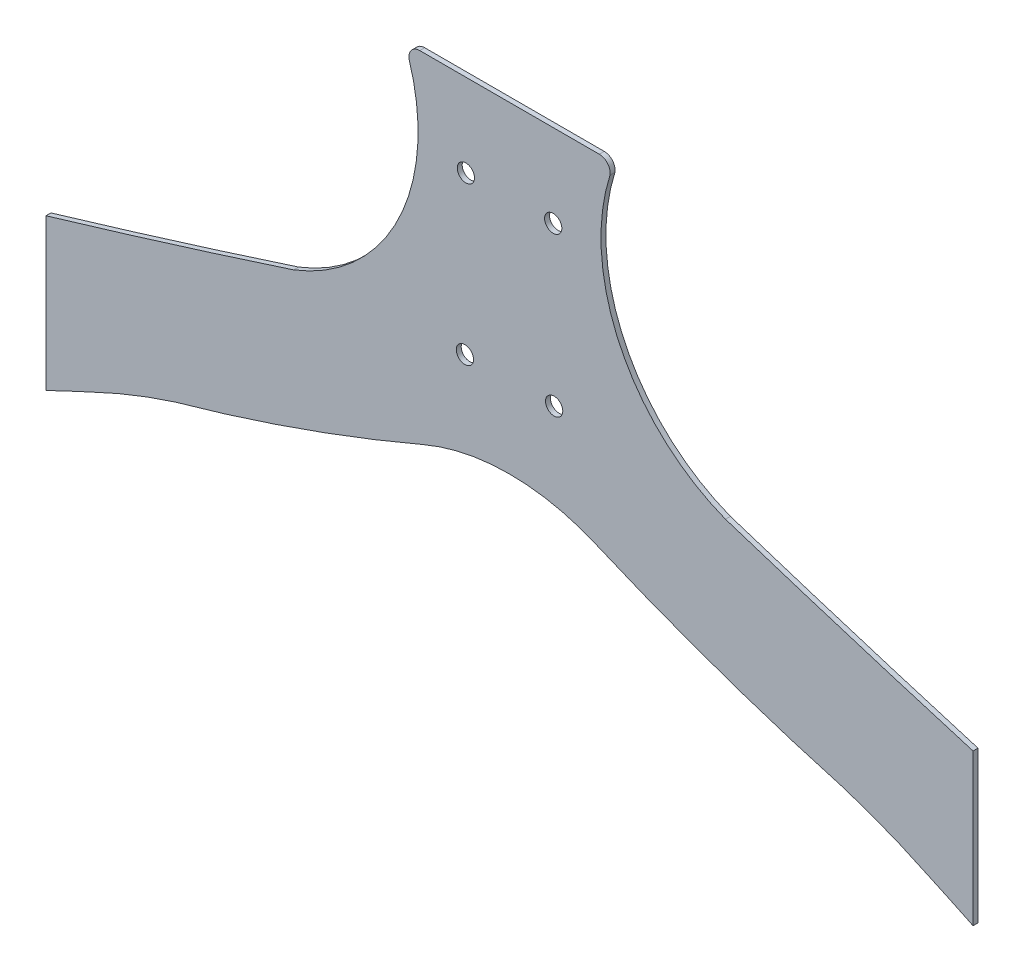
ISO-10303-21;
HEADER;
FILE_DESCRIPTION(('STEP AP214'),'2;1');
FILE_NAME('part.step','',(''),(''),'','','');
FILE_SCHEMA(('AUTOMOTIVE_DESIGN { 1 0 10303 214 1 1 1 1 }'));
ENDSEC;
DATA;
#1=APPLICATION_CONTEXT('core data for automotive mechanical design processes');
#2=APPLICATION_PROTOCOL_DEFINITION('international standard','automotive_design',2000,#1);
#3=PRODUCT_CONTEXT('',#1,'mechanical');
#4=PRODUCT('Part','Part','',(#3));
#5=PRODUCT_RELATED_PRODUCT_CATEGORY('part','',(#4));
#6=PRODUCT_DEFINITION_FORMATION('','',#4);
#7=PRODUCT_DEFINITION_CONTEXT('part definition',#1,'design');
#8=PRODUCT_DEFINITION('design','',#6,#7);
#9=PRODUCT_DEFINITION_SHAPE('','',#8);
#10=(LENGTH_UNIT() NAMED_UNIT(*) SI_UNIT(.MILLI.,.METRE.));
#11=(NAMED_UNIT(*) PLANE_ANGLE_UNIT() SI_UNIT($,.RADIAN.));
#12=(NAMED_UNIT(*) SI_UNIT($,.STERADIAN.) SOLID_ANGLE_UNIT());
#13=UNCERTAINTY_MEASURE_WITH_UNIT(LENGTH_MEASURE(1.E-05),#10,'distance_accuracy_value','');
#14=(GEOMETRIC_REPRESENTATION_CONTEXT(3) GLOBAL_UNCERTAINTY_ASSIGNED_CONTEXT((#13)) GLOBAL_UNIT_ASSIGNED_CONTEXT((#10,
#11,#12)) REPRESENTATION_CONTEXT('',''));
#15=CARTESIAN_POINT('',(0.,0.,0.));
#16=DIRECTION('',(0.,0.,1.));
#17=DIRECTION('',(1.,0.,0.));
#18=AXIS2_PLACEMENT_3D('',#15,#16,#17);
#19=CARTESIAN_POINT('',(-596.9,-624.582509856691,0.));
#20=DIRECTION('',(1.,0.,0.));
#21=DIRECTION('',(0.,0.,-1.));
#22=AXIS2_PLACEMENT_3D('',#19,#20,#21);
#23=PLANE('',#22);
#24=DIRECTION('',(0.,0.,-1.));
#25=VECTOR('',#24,1.);
#26=CARTESIAN_POINT('',(-596.9,-441.82233316805,6.35));
#27=LINE('',#26,#25);
#28=CARTESIAN_POINT('',(-596.9,-441.82233316805,0.));
#29=VERTEX_POINT('',#28);
#30=CARTESIAN_POINT('',(-596.9,-441.82233316805,6.35));
#31=VERTEX_POINT('',#30);
#32=EDGE_CURVE('E240',#29,#31,#27,.F.);
#33=ORIENTED_EDGE('',*,*,#32,.T.);
#34=DIRECTION('',(0.,1.,0.));
#35=VECTOR('',#34,1.);
#36=CARTESIAN_POINT('',(-596.9,-2169.24955294867,6.35));
#37=LINE('',#36,#35);
#38=CARTESIAN_POINT('',(-596.9,-246.912409222542,6.35));
#39=VERTEX_POINT('',#38);
#40=EDGE_CURVE('E45',#31,#39,#37,.T.);
#41=ORIENTED_EDGE('',*,*,#40,.T.);
#42=DIRECTION('',(0.,0.,-1.));
#43=VECTOR('',#42,1.);
#44=CARTESIAN_POINT('',(-596.9,-246.912409222542,6.35));
#45=LINE('',#44,#43);
#46=CARTESIAN_POINT('',(-596.9,-246.912409222542,0.));
#47=VERTEX_POINT('',#46);
#48=EDGE_CURVE('E244',#39,#47,#45,.T.);
#49=ORIENTED_EDGE('',*,*,#48,.T.);
#50=DIRECTION('',(0.,1.,0.));
#51=VECTOR('',#50,1.);
#52=CARTESIAN_POINT('',(-596.9,-2169.24955294867,0.));
#53=LINE('',#52,#51);
#54=EDGE_CURVE('E239',#29,#47,#53,.T.);
#55=ORIENTED_EDGE('',*,*,#54,.F.);
#56=EDGE_LOOP('',(#33,#41,#49,#55));
#57=FACE_BOUND('',#56,.T.);
#58=ADVANCED_FACE('F42',(#57),#23,.F.);
#59=CARTESIAN_POINT('',(596.9,-624.582509856691,0.));
#60=DIRECTION('',(-1.,0.,0.));
#61=DIRECTION('',(0.,0.,-1.));
#62=AXIS2_PLACEMENT_3D('',#59,#60,#61);
#63=PLANE('',#62);
#64=DIRECTION('',(0.,0.,-1.));
#65=VECTOR('',#64,1.);
#66=CARTESIAN_POINT('',(596.9,-441.822333168051,6.35));
#67=LINE('',#66,#65);
#68=CARTESIAN_POINT('',(596.9,-441.822333168051,6.35));
#69=VERTEX_POINT('',#68);
#70=CARTESIAN_POINT('',(596.9,-441.822333168051,0.));
#71=VERTEX_POINT('',#70);
#72=EDGE_CURVE('E236',#69,#71,#67,.T.);
#73=ORIENTED_EDGE('',*,*,#72,.T.);
#74=DIRECTION('',(0.,-1.,0.));
#75=VECTOR('',#74,1.);
#76=CARTESIAN_POINT('',(596.9,-2169.24955294867,0.));
#77=LINE('',#76,#75);
#78=CARTESIAN_POINT('',(596.9,-246.91240922256,0.));
#79=VERTEX_POINT('',#78);
#80=EDGE_CURVE('E251',#79,#71,#77,.T.);
#81=ORIENTED_EDGE('',*,*,#80,.F.);
#82=DIRECTION('',(0.,0.,-1.));
#83=VECTOR('',#82,1.);
#84=CARTESIAN_POINT('',(596.9,-246.91240922256,6.35));
#85=LINE('',#84,#83);
#86=CARTESIAN_POINT('',(596.9,-246.91240922256,6.35));
#87=VERTEX_POINT('',#86);
#88=EDGE_CURVE('E241',#79,#87,#85,.F.);
#89=ORIENTED_EDGE('',*,*,#88,.T.);
#90=DIRECTION('',(0.,-1.,0.));
#91=VECTOR('',#90,1.);
#92=CARTESIAN_POINT('',(596.9,-2169.24955294867,6.35));
#93=LINE('',#92,#91);
#94=EDGE_CURVE('E255',#87,#69,#93,.T.);
#95=ORIENTED_EDGE('',*,*,#94,.T.);
#96=EDGE_LOOP('',(#73,#81,#89,#95));
#97=FACE_BOUND('',#96,.T.);
#98=ADVANCED_FACE('F362',(#97),#63,.F.);
#99=CARTESIAN_POINT('',(-180.792418911107,-1158.29224131814,6.35));
#100=DIRECTION('',(0.,0.,-1.));
#101=DIRECTION('',(-1.,0.,0.));
#102=AXIS2_PLACEMENT_3D('',#99,#100,#101);
#103=CYLINDRICAL_SURFACE('',#102,825.460133846594);
#104=CARTESIAN_POINT('',(-180.792418911107,-1158.29224131814,0.));
#105=DIRECTION('',(0.,0.,1.));
#106=DIRECTION('',(1.,0.,0.));
#107=AXIS2_PLACEMENT_3D('',#104,#105,#106);
#108=CIRCLE('',#107,825.460133846594);
#109=CARTESIAN_POINT('',(-430.310537922391,-371.447186142019,0.));
#110=VERTEX_POINT('',#109);
#111=CARTESIAN_POINT('',(-538.684025261845,-414.452184132639,0.));
#112=VERTEX_POINT('',#111);
#113=EDGE_CURVE('E327',#110,#112,#108,.T.);
#114=ORIENTED_EDGE('',*,*,#113,.F.);
#115=DIRECTION('',(0.,0.,-1.));
#116=VECTOR('',#115,1.);
#117=CARTESIAN_POINT('',(-430.310537922391,-371.447186142019,6.35));
#118=LINE('',#117,#116);
#119=CARTESIAN_POINT('',(-430.310537922391,-371.447186142019,6.35));
#120=VERTEX_POINT('',#119);
#121=EDGE_CURVE('E302',#120,#110,#118,.T.);
#122=ORIENTED_EDGE('',*,*,#121,.F.);
#123=CARTESIAN_POINT('',(-180.792418911107,-1158.29224131814,6.35));
#124=DIRECTION('',(0.,0.,1.));
#125=DIRECTION('',(1.,0.,0.));
#126=AXIS2_PLACEMENT_3D('',#123,#124,#125);
#127=CIRCLE('',#126,825.460133846594);
#128=CARTESIAN_POINT('',(-538.684025261845,-414.452184132639,6.35));
#129=VERTEX_POINT('',#128);
#130=EDGE_CURVE('E201',#120,#129,#127,.T.);
#131=ORIENTED_EDGE('',*,*,#130,.T.);
#132=DIRECTION('',(0.,0.,-1.));
#133=VECTOR('',#132,1.);
#134=CARTESIAN_POINT('',(-538.684025261845,-414.452184132639,6.35));
#135=LINE('',#134,#133);
#136=EDGE_CURVE('E254',#129,#112,#135,.T.);
#137=ORIENTED_EDGE('',*,*,#136,.T.);
#138=EDGE_LOOP('',(#114,#122,#131,#137));
#139=FACE_BOUND('',#138,.T.);
#140=ADVANCED_FACE('F381',(#139),#103,.F.);
#141=CARTESIAN_POINT('',(-1123.56332868816,2110.77701358517,6.35));
#142=DIRECTION('',(0.,0.,-1.));
#143=DIRECTION('',(-1.,0.,0.));
#144=AXIS2_PLACEMENT_3D('',#141,#142,#143);
#145=CYLINDRICAL_SURFACE('',#144,2577.21485515194);
#146=CARTESIAN_POINT('',(-1123.56332868816,2110.77701358517,0.));
#147=DIRECTION('',(0.,0.,1.));
#148=DIRECTION('',(1.,0.,0.));
#149=AXIS2_PLACEMENT_3D('',#146,#147,#148);
#150=CIRCLE('',#149,2577.21485515194);
#151=CARTESIAN_POINT('',(-110.584086980493,-259.014003674616,0.));
#152=VERTEX_POINT('',#151);
#153=EDGE_CURVE('E324',#110,#152,#150,.T.);
#154=ORIENTED_EDGE('',*,*,#153,.T.);
#155=DIRECTION('',(0.,0.,-1.));
#156=VECTOR('',#155,1.);
#157=CARTESIAN_POINT('',(-110.584086980493,-259.014003674616,6.35));
#158=LINE('',#157,#156);
#159=CARTESIAN_POINT('',(-110.584086980493,-259.014003674616,6.35));
#160=VERTEX_POINT('',#159);
#161=EDGE_CURVE('E304',#160,#152,#158,.T.);
#162=ORIENTED_EDGE('',*,*,#161,.F.);
#163=CARTESIAN_POINT('',(-1123.56332868816,2110.77701358517,6.35));
#164=DIRECTION('',(0.,0.,1.));
#165=DIRECTION('',(1.,0.,0.));
#166=AXIS2_PLACEMENT_3D('',#163,#164,#165);
#167=CIRCLE('',#166,2577.21485515194);
#168=EDGE_CURVE('E199',#120,#160,#167,.T.);
#169=ORIENTED_EDGE('',*,*,#168,.F.);
#170=ORIENTED_EDGE('',*,*,#121,.T.);
#171=EDGE_LOOP('',(#154,#162,#169,#170));
#172=FACE_BOUND('',#171,.T.);
#173=ADVANCED_FACE('F386',(#172),#145,.T.);
#174=CARTESIAN_POINT('',(-0.50498949323341,-516.536019600514,6.35));
#175=DIRECTION('',(0.,0.,-1.));
#176=DIRECTION('',(-1.,0.,0.));
#177=AXIS2_PLACEMENT_3D('',#174,#175,#176);
#178=CYLINDRICAL_SURFACE('',#177,280.062486581386);
#179=CARTESIAN_POINT('',(-0.50498949323341,-516.536019600514,0.));
#180=DIRECTION('',(0.,0.,1.));
#181=DIRECTION('',(1.,0.,0.));
#182=AXIS2_PLACEMENT_3D('',#179,#180,#181);
#183=CIRCLE('',#182,280.062486581386);
#184=CARTESIAN_POINT('',(1.59837854757372E-10,-236.473988300731,0.));
#185=VERTEX_POINT('',#184);
#186=EDGE_CURVE('E321',#185,#152,#183,.T.);
#187=ORIENTED_EDGE('',*,*,#186,.F.);
#188=DIRECTION('',(0.,0.,-1.));
#189=VECTOR('',#188,1.);
#190=CARTESIAN_POINT('',(1.59837854757372E-10,-236.473988300731,6.35));
#191=LINE('',#190,#189);
#192=CARTESIAN_POINT('',(1.59837854757372E-10,-236.473988300731,6.35));
#193=VERTEX_POINT('',#192);
#194=EDGE_CURVE('E306',#193,#185,#191,.T.);
#195=ORIENTED_EDGE('',*,*,#194,.F.);
#196=CARTESIAN_POINT('',(-0.50498949323341,-516.536019600514,6.35));
#197=DIRECTION('',(0.,0.,1.));
#198=DIRECTION('',(1.,0.,0.));
#199=AXIS2_PLACEMENT_3D('',#196,#197,#198);
#200=CIRCLE('',#199,280.062486581386);
#201=EDGE_CURVE('E196',#193,#160,#200,.T.);
#202=ORIENTED_EDGE('',*,*,#201,.T.);
#203=ORIENTED_EDGE('',*,*,#161,.T.);
#204=EDGE_LOOP('',(#187,#195,#202,#203));
#205=FACE_BOUND('',#204,.T.);
#206=ADVANCED_FACE('F432',(#205),#178,.F.);
#207=CARTESIAN_POINT('',(0.50498949323341,-516.536019600514,6.35));
#208=DIRECTION('',(0.,0.,-1.));
#209=DIRECTION('',(-1.,0.,0.));
#210=AXIS2_PLACEMENT_3D('',#207,#208,#209);
#211=CYLINDRICAL_SURFACE('',#210,280.062486581385);
#212=CARTESIAN_POINT('',(0.50498949323341,-516.536019600514,0.));
#213=DIRECTION('',(0.,0.,1.));
#214=DIRECTION('',(1.,0.,0.));
#215=AXIS2_PLACEMENT_3D('',#212,#213,#214);
#216=CIRCLE('',#215,280.062486581385);
#217=CARTESIAN_POINT('',(110.584086980493,-259.014003674616,0.));
#218=VERTEX_POINT('',#217);
#219=EDGE_CURVE('E318',#218,#185,#216,.T.);
#220=ORIENTED_EDGE('',*,*,#219,.F.);
#221=DIRECTION('',(0.,0.,-1.));
#222=VECTOR('',#221,1.);
#223=CARTESIAN_POINT('',(110.584086980493,-259.014003674616,6.35));
#224=LINE('',#223,#222);
#225=CARTESIAN_POINT('',(110.584086980493,-259.014003674616,6.35));
#226=VERTEX_POINT('',#225);
#227=EDGE_CURVE('E308',#226,#218,#224,.T.);
#228=ORIENTED_EDGE('',*,*,#227,.F.);
#229=CARTESIAN_POINT('',(0.50498949323341,-516.536019600514,6.35));
#230=DIRECTION('',(0.,0.,1.));
#231=DIRECTION('',(1.,0.,0.));
#232=AXIS2_PLACEMENT_3D('',#229,#230,#231);
#233=CIRCLE('',#232,280.062486581385);
#234=EDGE_CURVE('E193',#226,#193,#233,.T.);
#235=ORIENTED_EDGE('',*,*,#234,.T.);
#236=ORIENTED_EDGE('',*,*,#194,.T.);
#237=EDGE_LOOP('',(#220,#228,#235,#236));
#238=FACE_BOUND('',#237,.T.);
#239=ADVANCED_FACE('F436',(#238),#211,.F.);
#240=CARTESIAN_POINT('',(1123.56332868816,2110.77701358517,6.35));
#241=DIRECTION('',(0.,0.,-1.));
#242=DIRECTION('',(-1.,0.,0.));
#243=AXIS2_PLACEMENT_3D('',#240,#241,#242);
#244=CYLINDRICAL_SURFACE('',#243,2577.21485515194);
#245=CARTESIAN_POINT('',(1123.56332868816,2110.77701358517,0.));
#246=DIRECTION('',(0.,0.,1.));
#247=DIRECTION('',(1.,0.,0.));
#248=AXIS2_PLACEMENT_3D('',#245,#246,#247);
#249=CIRCLE('',#248,2577.21485515194);
#250=CARTESIAN_POINT('',(430.310537918041,-371.447186140804,0.));
#251=VERTEX_POINT('',#250);
#252=EDGE_CURVE('E315',#218,#251,#249,.T.);
#253=ORIENTED_EDGE('',*,*,#252,.T.);
#254=DIRECTION('',(0.,0.,-1.));
#255=VECTOR('',#254,1.);
#256=CARTESIAN_POINT('',(430.310537918041,-371.447186140804,6.35));
#257=LINE('',#256,#255);
#258=CARTESIAN_POINT('',(430.310537918041,-371.447186140804,6.35));
#259=VERTEX_POINT('',#258);
#260=EDGE_CURVE('E310',#259,#251,#257,.T.);
#261=ORIENTED_EDGE('',*,*,#260,.F.);
#262=CARTESIAN_POINT('',(1123.56332868816,2110.77701358517,6.35));
#263=DIRECTION('',(0.,0.,1.));
#264=DIRECTION('',(1.,0.,0.));
#265=AXIS2_PLACEMENT_3D('',#262,#263,#264);
#266=CIRCLE('',#265,2577.21485515194);
#267=EDGE_CURVE('E190',#226,#259,#266,.T.);
#268=ORIENTED_EDGE('',*,*,#267,.F.);
#269=ORIENTED_EDGE('',*,*,#227,.T.);
#270=EDGE_LOOP('',(#253,#261,#268,#269));
#271=FACE_BOUND('',#270,.T.);
#272=ADVANCED_FACE('F440',(#271),#244,.T.);
#273=CARTESIAN_POINT('',(180.792418911064,-1158.29224131828,6.35));
#274=DIRECTION('',(0.,0.,-1.));
#275=DIRECTION('',(-1.,0.,0.));
#276=AXIS2_PLACEMENT_3D('',#273,#274,#275);
#277=CYLINDRICAL_SURFACE('',#276,825.460133846586);
#278=CARTESIAN_POINT('',(180.792418911064,-1158.29224131828,0.));
#279=DIRECTION('',(0.,0.,1.));
#280=DIRECTION('',(1.,0.,0.));
#281=AXIS2_PLACEMENT_3D('',#278,#279,#280);
#282=CIRCLE('',#281,825.460133846586);
#283=CARTESIAN_POINT('',(538.684025260286,-414.452184132056,0.));
#284=VERTEX_POINT('',#283);
#285=EDGE_CURVE('E247',#284,#251,#282,.T.);
#286=ORIENTED_EDGE('',*,*,#285,.F.);
#287=DIRECTION('',(0.,0.,-1.));
#288=VECTOR('',#287,1.);
#289=CARTESIAN_POINT('',(538.684025260286,-414.452184132056,6.35));
#290=LINE('',#289,#288);
#291=CARTESIAN_POINT('',(538.684025260286,-414.452184132056,6.35));
#292=VERTEX_POINT('',#291);
#293=EDGE_CURVE('E312',#292,#284,#290,.T.);
#294=ORIENTED_EDGE('',*,*,#293,.F.);
#295=CARTESIAN_POINT('',(180.792418911064,-1158.29224131828,6.35));
#296=DIRECTION('',(0.,0.,1.));
#297=DIRECTION('',(1.,0.,0.));
#298=AXIS2_PLACEMENT_3D('',#295,#296,#297);
#299=CIRCLE('',#298,825.460133846586);
#300=EDGE_CURVE('E187',#292,#259,#299,.T.);
#301=ORIENTED_EDGE('',*,*,#300,.T.);
#302=ORIENTED_EDGE('',*,*,#260,.T.);
#303=EDGE_LOOP('',(#286,#294,#301,#302));
#304=FACE_BOUND('',#303,.T.);
#305=ADVANCED_FACE('F373',(#304),#277,.F.);
#306=CARTESIAN_POINT('',(-577.914172720365,-2865.04040656693,6.35));
#307=DIRECTION('',(0.,0.,-1.));
#308=DIRECTION('',(-1.,0.,0.));
#309=AXIS2_PLACEMENT_3D('',#306,#307,#308);
#310=CYLINDRICAL_SURFACE('',#309,2692.98610684712);
#311=ORIENTED_EDGE('',*,*,#72,.F.);
#312=CARTESIAN_POINT('',(-577.914172720365,-2865.04040656693,6.35));
#313=DIRECTION('',(0.,0.,1.));
#314=DIRECTION('',(1.,0.,0.));
#315=AXIS2_PLACEMENT_3D('',#312,#313,#314);
#316=CIRCLE('',#315,2692.98610684712);
#317=EDGE_CURVE('E207',#69,#292,#316,.T.);
#318=ORIENTED_EDGE('',*,*,#317,.T.);
#319=ORIENTED_EDGE('',*,*,#293,.T.);
#320=CARTESIAN_POINT('',(-577.914172720365,-2865.04040656693,0.));
#321=DIRECTION('',(0.,0.,1.));
#322=DIRECTION('',(1.,0.,0.));
#323=AXIS2_PLACEMENT_3D('',#320,#321,#322);
#324=CIRCLE('',#323,2692.98610684712);
#325=EDGE_CURVE('E119',#71,#284,#324,.T.);
#326=ORIENTED_EDGE('',*,*,#325,.F.);
#327=EDGE_LOOP('',(#311,#318,#319,#326));
#328=FACE_BOUND('',#327,.T.);
#329=ADVANCED_FACE('F366',(#328),#310,.F.);
#330=CARTESIAN_POINT('',(4330.12511720554,12331.960297847,6.35));
#331=DIRECTION('',(0.,0.,-1.));
#332=DIRECTION('',(-1.,0.,0.));
#333=AXIS2_PLACEMENT_3D('',#330,#331,#332);
#334=CYLINDRICAL_SURFACE('',#333,13121.1664251466);
#335=ORIENTED_EDGE('',*,*,#88,.F.);
#336=CARTESIAN_POINT('',(4330.12511720554,12331.960297847,0.));
#337=DIRECTION('',(0.,0.,1.));
#338=DIRECTION('',(1.,0.,0.));
#339=AXIS2_PLACEMENT_3D('',#336,#337,#338);
#340=CIRCLE('',#339,13121.1664251466);
#341=CARTESIAN_POINT('',(278.076451396181,-147.85981168616,0.));
#342=VERTEX_POINT('',#341);
#343=EDGE_CURVE('E11',#342,#79,#340,.T.);
#344=ORIENTED_EDGE('',*,*,#343,.F.);
#345=DIRECTION('',(0.,0.,-1.));
#346=VECTOR('',#345,1.);
#347=CARTESIAN_POINT('',(278.076451396181,-147.85981168616,6.35));
#348=LINE('',#347,#346);
#349=CARTESIAN_POINT('',(278.076451396181,-147.85981168616,6.35));
#350=VERTEX_POINT('',#349);
#351=EDGE_CURVE('E60',#350,#342,#348,.T.);
#352=ORIENTED_EDGE('',*,*,#351,.F.);
#353=CARTESIAN_POINT('',(4330.12511720554,12331.960297847,6.35));
#354=DIRECTION('',(0.,0.,1.));
#355=DIRECTION('',(1.,0.,0.));
#356=AXIS2_PLACEMENT_3D('',#353,#354,#355);
#357=CIRCLE('',#356,13121.1664251466);
#358=EDGE_CURVE('E235',#350,#87,#357,.T.);
#359=ORIENTED_EDGE('',*,*,#358,.T.);
#360=EDGE_LOOP('',(#335,#344,#352,#359));
#361=FACE_BOUND('',#360,.T.);
#362=ADVANCED_FACE('F363',(#361),#334,.F.);
#363=CARTESIAN_POINT('',(368.525029715993,86.0314111701701,6.35));
#364=DIRECTION('',(0.,0.,-1.));
#365=DIRECTION('',(-1.,0.,0.));
#366=AXIS2_PLACEMENT_3D('',#363,#364,#365);
#367=CYLINDRICAL_SURFACE('',#366,250.770910293249);
#368=CARTESIAN_POINT('',(368.525029715993,86.0314111701701,0.));
#369=DIRECTION('',(0.,0.,1.));
#370=DIRECTION('',(1.,0.,0.));
#371=AXIS2_PLACEMENT_3D('',#368,#369,#370);
#372=CIRCLE('',#371,250.770910293249);
#373=CARTESIAN_POINT('',(129.34050997468,161.376052422364,0.));
#374=VERTEX_POINT('',#373);
#375=EDGE_CURVE('E51',#374,#342,#372,.T.);
#376=ORIENTED_EDGE('',*,*,#375,.F.);
#377=DIRECTION('',(0.,0.,-1.));
#378=VECTOR('',#377,1.);
#379=CARTESIAN_POINT('',(129.34050997468,161.376052422364,6.35));
#380=LINE('',#379,#378);
#381=CARTESIAN_POINT('',(129.34050997468,161.376052422364,6.35));
#382=VERTEX_POINT('',#381);
#383=EDGE_CURVE('E106',#382,#374,#380,.T.);
#384=ORIENTED_EDGE('',*,*,#383,.F.);
#385=CARTESIAN_POINT('',(368.525029715993,86.0314111701701,6.35));
#386=DIRECTION('',(0.,0.,1.));
#387=DIRECTION('',(1.,0.,0.));
#388=AXIS2_PLACEMENT_3D('',#385,#386,#387);
#389=CIRCLE('',#388,250.770910293249);
#390=EDGE_CURVE('E232',#382,#350,#389,.T.);
#391=ORIENTED_EDGE('',*,*,#390,.T.);
#392=ORIENTED_EDGE('',*,*,#351,.T.);
#393=EDGE_LOOP('',(#376,#384,#391,#392));
#394=FACE_BOUND('',#393,.T.);
#395=ADVANCED_FACE('F365',(#394),#367,.F.);
#396=CARTESIAN_POINT('',(115.577769156483,163.959549306309,6.35));
#397=DIRECTION('',(0.,0.,-1.));
#398=DIRECTION('',(-1.,0.,0.));
#399=AXIS2_PLACEMENT_3D('',#396,#397,#398);
#400=CYLINDRICAL_SURFACE('',#399,14.0031243291206);
#401=CARTESIAN_POINT('',(115.577769156483,163.959549306309,0.));
#402=DIRECTION('',(0.,0.,1.));
#403=DIRECTION('',(1.,0.,0.));
#404=AXIS2_PLACEMENT_3D('',#401,#402,#403);
#405=CIRCLE('',#404,14.0031243291206);
#406=CARTESIAN_POINT('',(115.577769156483,177.962673635379,0.));
#407=VERTEX_POINT('',#406);
#408=EDGE_CURVE('E160',#374,#407,#405,.T.);
#409=ORIENTED_EDGE('',*,*,#408,.T.);
#410=DIRECTION('',(0.,0.,-1.));
#411=VECTOR('',#410,1.);
#412=CARTESIAN_POINT('',(115.577769156483,177.962673635379,6.35));
#413=LINE('',#412,#411);
#414=CARTESIAN_POINT('',(115.577769156483,177.962673635379,6.35));
#415=VERTEX_POINT('',#414);
#416=EDGE_CURVE('E170',#415,#407,#413,.T.);
#417=ORIENTED_EDGE('',*,*,#416,.F.);
#418=CARTESIAN_POINT('',(115.577769156483,163.959549306309,6.35));
#419=DIRECTION('',(0.,0.,1.));
#420=DIRECTION('',(1.,0.,0.));
#421=AXIS2_PLACEMENT_3D('',#418,#419,#420);
#422=CIRCLE('',#421,14.0031243291206);
#423=EDGE_CURVE('E229',#382,#415,#422,.T.);
#424=ORIENTED_EDGE('',*,*,#423,.F.);
#425=ORIENTED_EDGE('',*,*,#383,.T.);
#426=EDGE_LOOP('',(#409,#417,#424,#425));
#427=FACE_BOUND('',#426,.T.);
#428=ADVANCED_FACE('F179',(#427),#400,.T.);
#429=CARTESIAN_POINT('',(-10.0304702540838,177.962673635403,6.35));
#430=DIRECTION('',(-1.84432371626263E-13,-1.,0.));
#431=DIRECTION('',(1.,-1.84432371626263E-13,0.));
#432=AXIS2_PLACEMENT_3D('',#429,#430,#431);
#433=PLANE('',#432);
#434=DIRECTION('',(-1.,1.84432371626263E-13,0.));
#435=VECTOR('',#434,1.);
#436=CARTESIAN_POINT('',(-10.0304702540838,177.962673635403,0.));
#437=LINE('',#436,#435);
#438=CARTESIAN_POINT('',(-115.577769156483,177.96267363538,0.));
#439=VERTEX_POINT('',#438);
#440=EDGE_CURVE('E154',#407,#439,#437,.T.);
#441=ORIENTED_EDGE('',*,*,#440,.T.);
#442=DIRECTION('',(0.,0.,-1.));
#443=VECTOR('',#442,1.);
#444=CARTESIAN_POINT('',(-115.577769156483,177.96267363538,6.35));
#445=LINE('',#444,#443);
#446=CARTESIAN_POINT('',(-115.577769156483,177.96267363538,6.35));
#447=VERTEX_POINT('',#446);
#448=EDGE_CURVE('E177',#447,#439,#445,.T.);
#449=ORIENTED_EDGE('',*,*,#448,.F.);
#450=DIRECTION('',(-1.,1.84432371626263E-13,0.));
#451=VECTOR('',#450,1.);
#452=CARTESIAN_POINT('',(-10.0304702540838,177.962673635403,6.35));
#453=LINE('',#452,#451);
#454=EDGE_CURVE('E173',#415,#447,#453,.T.);
#455=ORIENTED_EDGE('',*,*,#454,.F.);
#456=ORIENTED_EDGE('',*,*,#416,.T.);
#457=EDGE_LOOP('',(#441,#449,#455,#456));
#458=FACE_BOUND('',#457,.T.);
#459=ADVANCED_FACE('F171',(#458),#433,.F.);
#460=CARTESIAN_POINT('',(-115.577769156483,163.959549306309,6.35));
#461=DIRECTION('',(0.,0.,-1.));
#462=DIRECTION('',(-1.,0.,0.));
#463=AXIS2_PLACEMENT_3D('',#460,#461,#462);
#464=CYLINDRICAL_SURFACE('',#463,14.003124329107);
#465=CARTESIAN_POINT('',(-115.577769156483,163.959549306309,0.));
#466=DIRECTION('',(0.,0.,1.));
#467=DIRECTION('',(1.,0.,0.));
#468=AXIS2_PLACEMENT_3D('',#465,#466,#467);
#469=CIRCLE('',#468,14.003124329107);
#470=CARTESIAN_POINT('',(-129.340509974613,161.376052422156,0.));
#471=VERTEX_POINT('',#470);
#472=EDGE_CURVE('E163',#439,#471,#469,.T.);
#473=ORIENTED_EDGE('',*,*,#472,.T.);
#474=DIRECTION('',(0.,0.,-1.));
#475=VECTOR('',#474,1.);
#476=CARTESIAN_POINT('',(-129.340509974613,161.376052422156,6.35));
#477=LINE('',#476,#475);
#478=CARTESIAN_POINT('',(-129.340509974613,161.376052422156,6.35));
#479=VERTEX_POINT('',#478);
#480=EDGE_CURVE('E296',#479,#471,#477,.T.);
#481=ORIENTED_EDGE('',*,*,#480,.F.);
#482=CARTESIAN_POINT('',(-115.577769156483,163.959549306309,6.35));
#483=DIRECTION('',(0.,0.,1.));
#484=DIRECTION('',(1.,0.,0.));
#485=AXIS2_PLACEMENT_3D('',#482,#483,#484);
#486=CIRCLE('',#485,14.003124329107);
#487=EDGE_CURVE('E226',#447,#479,#486,.T.);
#488=ORIENTED_EDGE('',*,*,#487,.F.);
#489=ORIENTED_EDGE('',*,*,#448,.T.);
#490=EDGE_LOOP('',(#473,#481,#488,#489));
#491=FACE_BOUND('',#490,.T.);
#492=ADVANCED_FACE('F345',(#491),#464,.T.);
#493=CARTESIAN_POINT('',(-368.525029715992,86.0314111701701,6.35));
#494=DIRECTION('',(0.,0.,-1.));
#495=DIRECTION('',(-1.,0.,0.));
#496=AXIS2_PLACEMENT_3D('',#493,#494,#495);
#497=CYLINDRICAL_SURFACE('',#496,250.770910293249);
#498=CARTESIAN_POINT('',(-368.525029715992,86.0314111701701,0.));
#499=DIRECTION('',(0.,0.,1.));
#500=DIRECTION('',(1.,0.,0.));
#501=AXIS2_PLACEMENT_3D('',#498,#499,#500);
#502=CIRCLE('',#501,250.770910293249);
#503=CARTESIAN_POINT('',(-278.076451395783,-147.859811686006,0.));
#504=VERTEX_POINT('',#503);
#505=EDGE_CURVE('E261',#504,#471,#502,.T.);
#506=ORIENTED_EDGE('',*,*,#505,.F.);
#507=DIRECTION('',(0.,0.,-1.));
#508=VECTOR('',#507,1.);
#509=CARTESIAN_POINT('',(-278.076451395783,-147.859811686006,6.35));
#510=LINE('',#509,#508);
#511=CARTESIAN_POINT('',(-278.076451395783,-147.859811686006,6.35));
#512=VERTEX_POINT('',#511);
#513=EDGE_CURVE('E191',#512,#504,#510,.T.);
#514=ORIENTED_EDGE('',*,*,#513,.F.);
#515=CARTESIAN_POINT('',(-368.525029715992,86.0314111701701,6.35));
#516=DIRECTION('',(0.,0.,1.));
#517=DIRECTION('',(1.,0.,0.));
#518=AXIS2_PLACEMENT_3D('',#515,#516,#517);
#519=CIRCLE('',#518,250.770910293249);
#520=EDGE_CURVE('E222',#512,#479,#519,.T.);
#521=ORIENTED_EDGE('',*,*,#520,.T.);
#522=ORIENTED_EDGE('',*,*,#480,.T.);
#523=EDGE_LOOP('',(#506,#514,#521,#522));
#524=FACE_BOUND('',#523,.T.);
#525=ADVANCED_FACE('F294',(#524),#497,.F.);
#526=CARTESIAN_POINT('',(-4330.12511720553,12331.960297847,6.35));
#527=DIRECTION('',(0.,0.,-1.));
#528=DIRECTION('',(-1.,0.,0.));
#529=AXIS2_PLACEMENT_3D('',#526,#527,#528);
#530=CYLINDRICAL_SURFACE('',#529,13121.1664251465);
#531=ORIENTED_EDGE('',*,*,#48,.F.);
#532=CARTESIAN_POINT('',(-4330.12511720553,12331.960297847,6.35));
#533=DIRECTION('',(0.,0.,1.));
#534=DIRECTION('',(1.,0.,0.));
#535=AXIS2_PLACEMENT_3D('',#532,#533,#534);
#536=CIRCLE('',#535,13121.1664251465);
#537=EDGE_CURVE('E221',#39,#512,#536,.T.);
#538=ORIENTED_EDGE('',*,*,#537,.T.);
#539=ORIENTED_EDGE('',*,*,#513,.T.);
#540=CARTESIAN_POINT('',(-4330.12511720553,12331.960297847,0.));
#541=DIRECTION('',(0.,0.,1.));
#542=DIRECTION('',(1.,0.,0.));
#543=AXIS2_PLACEMENT_3D('',#540,#541,#542);
#544=CIRCLE('',#543,13121.1664251465);
#545=EDGE_CURVE('E258',#47,#504,#544,.T.);
#546=ORIENTED_EDGE('',*,*,#545,.F.);
#547=EDGE_LOOP('',(#531,#538,#539,#546));
#548=FACE_BOUND('',#547,.T.);
#549=ADVANCED_FACE('F291',(#548),#530,.F.);
#550=CARTESIAN_POINT('',(577.914172720366,-2865.04040656693,6.35));
#551=DIRECTION('',(0.,0.,-1.));
#552=DIRECTION('',(-1.,0.,0.));
#553=AXIS2_PLACEMENT_3D('',#550,#551,#552);
#554=CYLINDRICAL_SURFACE('',#553,2692.98610684712);
#555=ORIENTED_EDGE('',*,*,#32,.F.);
#556=CARTESIAN_POINT('',(577.914172720366,-2865.04040656693,0.));
#557=DIRECTION('',(0.,0.,1.));
#558=DIRECTION('',(1.,0.,0.));
#559=AXIS2_PLACEMENT_3D('',#556,#557,#558);
#560=CIRCLE('',#559,2692.98610684712);
#561=EDGE_CURVE('E249',#112,#29,#560,.T.);
#562=ORIENTED_EDGE('',*,*,#561,.F.);
#563=ORIENTED_EDGE('',*,*,#136,.F.);
#564=CARTESIAN_POINT('',(577.914172720366,-2865.04040656693,6.35));
#565=DIRECTION('',(0.,0.,1.));
#566=DIRECTION('',(1.,0.,0.));
#567=AXIS2_PLACEMENT_3D('',#564,#565,#566);
#568=CIRCLE('',#567,2692.98610684712);
#569=EDGE_CURVE('E204',#129,#31,#568,.T.);
#570=ORIENTED_EDGE('',*,*,#569,.T.);
#571=EDGE_LOOP('',(#555,#562,#563,#570));
#572=FACE_BOUND('',#571,.T.);
#573=ADVANCED_FACE('F413',(#572),#554,.F.);
#574=CARTESIAN_POINT('',(56.2157798943925,71.187101166311,6.35));
#575=DIRECTION('',(0.,0.,-1.));
#576=DIRECTION('',(-1.,0.,0.));
#577=AXIS2_PLACEMENT_3D('',#574,#575,#576);
#578=CYLINDRICAL_SURFACE('',#577,11.1125000000003);
#579=CARTESIAN_POINT('',(56.2157798943925,71.187101166311,6.35));
#580=DIRECTION('',(0.,0.,1.));
#581=DIRECTION('',(1.,0.,0.));
#582=AXIS2_PLACEMENT_3D('',#579,#580,#581);
#583=CIRCLE('',#582,11.1125000000003);
#584=CARTESIAN_POINT('',(67.3282798943928,71.187101166311,6.35));
#585=VERTEX_POINT('',#584);
#586=EDGE_CURVE('E217',#585,#585,#583,.T.);
#587=ORIENTED_EDGE('',*,*,#586,.T.);
#588=EDGE_LOOP('',(#587));
#589=FACE_BOUND('',#588,.T.);
#590=CARTESIAN_POINT('',(56.2157798943925,71.187101166311,0.));
#591=DIRECTION('',(0.,0.,1.));
#592=DIRECTION('',(1.,0.,0.));
#593=AXIS2_PLACEMENT_3D('',#590,#591,#592);
#594=CIRCLE('',#593,11.1125000000003);
#595=CARTESIAN_POINT('',(67.3282798943928,71.187101166311,0.));
#596=VERTEX_POINT('',#595);
#597=EDGE_CURVE('E262',#596,#596,#594,.T.);
#598=ORIENTED_EDGE('',*,*,#597,.F.);
#599=EDGE_LOOP('',(#598));
#600=FACE_BOUND('',#599,.T.);
#601=ADVANCED_FACE('F410',(#589,#600),#578,.F.);
#602=CARTESIAN_POINT('',(57.4514048618369,-132.047353672922,6.35));
#603=DIRECTION('',(0.,0.,-1.));
#604=DIRECTION('',(-1.,0.,0.));
#605=AXIS2_PLACEMENT_3D('',#602,#603,#604);
#606=CYLINDRICAL_SURFACE('',#605,11.1125000000003);
#607=CARTESIAN_POINT('',(57.4514048618369,-132.047353672922,6.35));
#608=DIRECTION('',(0.,0.,1.));
#609=DIRECTION('',(1.,0.,0.));
#610=AXIS2_PLACEMENT_3D('',#607,#608,#609);
#611=CIRCLE('',#610,11.1125000000003);
#612=CARTESIAN_POINT('',(68.5639048618372,-132.047353672922,6.35));
#613=VERTEX_POINT('',#612);
#614=EDGE_CURVE('E214',#613,#613,#611,.T.);
#615=ORIENTED_EDGE('',*,*,#614,.T.);
#616=EDGE_LOOP('',(#615));
#617=FACE_BOUND('',#616,.T.);
#618=CARTESIAN_POINT('',(57.4514048618369,-132.047353672922,0.));
#619=DIRECTION('',(0.,0.,1.));
#620=DIRECTION('',(1.,0.,0.));
#621=AXIS2_PLACEMENT_3D('',#618,#619,#620);
#622=CIRCLE('',#621,11.1125000000003);
#623=CARTESIAN_POINT('',(68.5639048618372,-132.047353672922,0.));
#624=VERTEX_POINT('',#623);
#625=EDGE_CURVE('E336',#624,#624,#622,.T.);
#626=ORIENTED_EDGE('',*,*,#625,.F.);
#627=EDGE_LOOP('',(#626));
#628=FACE_BOUND('',#627,.T.);
#629=ADVANCED_FACE('F412',(#617,#628),#606,.F.);
#630=CARTESIAN_POINT('',(-57.4514048618369,-132.047353672922,6.35));
#631=DIRECTION('',(0.,0.,-1.));
#632=DIRECTION('',(-1.,0.,0.));
#633=AXIS2_PLACEMENT_3D('',#630,#631,#632);
#634=CYLINDRICAL_SURFACE('',#633,11.1125000000003);
#635=CARTESIAN_POINT('',(-57.4514048618369,-132.047353672922,6.35));
#636=DIRECTION('',(0.,0.,1.));
#637=DIRECTION('',(1.,0.,0.));
#638=AXIS2_PLACEMENT_3D('',#635,#636,#637);
#639=CIRCLE('',#638,11.1125000000003);
#640=CARTESIAN_POINT('',(-46.3389048618366,-132.047353672922,6.35));
#641=VERTEX_POINT('',#640);
#642=EDGE_CURVE('E211',#641,#641,#639,.T.);
#643=ORIENTED_EDGE('',*,*,#642,.T.);
#644=EDGE_LOOP('',(#643));
#645=FACE_BOUND('',#644,.T.);
#646=CARTESIAN_POINT('',(-57.4514048618369,-132.047353672922,0.));
#647=DIRECTION('',(0.,0.,1.));
#648=DIRECTION('',(1.,0.,0.));
#649=AXIS2_PLACEMENT_3D('',#646,#647,#648);
#650=CIRCLE('',#649,11.1125000000003);
#651=CARTESIAN_POINT('',(-46.3389048618366,-132.047353672922,0.));
#652=VERTEX_POINT('',#651);
#653=EDGE_CURVE('E333',#652,#652,#650,.T.);
#654=ORIENTED_EDGE('',*,*,#653,.F.);
#655=EDGE_LOOP('',(#654));
#656=FACE_BOUND('',#655,.T.);
#657=ADVANCED_FACE('F399',(#645,#656),#634,.F.);
#658=CARTESIAN_POINT('',(-56.2157798943925,71.187101166311,6.35));
#659=DIRECTION('',(0.,0.,-1.));
#660=DIRECTION('',(-1.,0.,0.));
#661=AXIS2_PLACEMENT_3D('',#658,#659,#660);
#662=CYLINDRICAL_SURFACE('',#661,11.1125000000003);
#663=CARTESIAN_POINT('',(-56.2157798943925,71.187101166311,6.35));
#664=DIRECTION('',(0.,0.,1.));
#665=DIRECTION('',(1.,0.,0.));
#666=AXIS2_PLACEMENT_3D('',#663,#664,#665);
#667=CIRCLE('',#666,11.1125000000003);
#668=CARTESIAN_POINT('',(-45.1032798943922,71.187101166311,6.35));
#669=VERTEX_POINT('',#668);
#670=EDGE_CURVE('E208',#669,#669,#667,.T.);
#671=ORIENTED_EDGE('',*,*,#670,.T.);
#672=EDGE_LOOP('',(#671));
#673=FACE_BOUND('',#672,.T.);
#674=CARTESIAN_POINT('',(-56.2157798943925,71.187101166311,0.));
#675=DIRECTION('',(0.,0.,1.));
#676=DIRECTION('',(1.,0.,0.));
#677=AXIS2_PLACEMENT_3D('',#674,#675,#676);
#678=CIRCLE('',#677,11.1125000000003);
#679=CARTESIAN_POINT('',(-45.1032798943922,71.187101166311,0.));
#680=VERTEX_POINT('',#679);
#681=EDGE_CURVE('E248',#680,#680,#678,.T.);
#682=ORIENTED_EDGE('',*,*,#681,.F.);
#683=EDGE_LOOP('',(#682));
#684=FACE_BOUND('',#683,.T.);
#685=ADVANCED_FACE('F394',(#673,#684),#662,.F.);
#686=CARTESIAN_POINT('',(-10.0304702545167,-2169.24955294867,0.));
#687=DIRECTION('',(0.,0.,1.));
#688=DIRECTION('',(1.,0.,0.));
#689=AXIS2_PLACEMENT_3D('',#686,#687,#688);
#690=PLANE('',#689);
#691=ORIENTED_EDGE('',*,*,#681,.T.);
#692=EDGE_LOOP('',(#691));
#693=FACE_BOUND('',#692,.T.);
#694=ORIENTED_EDGE('',*,*,#653,.T.);
#695=EDGE_LOOP('',(#694));
#696=FACE_BOUND('',#695,.T.);
#697=ORIENTED_EDGE('',*,*,#625,.T.);
#698=EDGE_LOOP('',(#697));
#699=FACE_BOUND('',#698,.T.);
#700=ORIENTED_EDGE('',*,*,#597,.T.);
#701=EDGE_LOOP('',(#700));
#702=FACE_BOUND('',#701,.T.);
#703=ORIENTED_EDGE('',*,*,#561,.T.);
#704=ORIENTED_EDGE('',*,*,#54,.T.);
#705=ORIENTED_EDGE('',*,*,#545,.T.);
#706=ORIENTED_EDGE('',*,*,#505,.T.);
#707=ORIENTED_EDGE('',*,*,#472,.F.);
#708=ORIENTED_EDGE('',*,*,#440,.F.);
#709=ORIENTED_EDGE('',*,*,#408,.F.);
#710=ORIENTED_EDGE('',*,*,#375,.T.);
#711=ORIENTED_EDGE('',*,*,#343,.T.);
#712=ORIENTED_EDGE('',*,*,#80,.T.);
#713=ORIENTED_EDGE('',*,*,#325,.T.);
#714=ORIENTED_EDGE('',*,*,#285,.T.);
#715=ORIENTED_EDGE('',*,*,#252,.F.);
#716=ORIENTED_EDGE('',*,*,#219,.T.);
#717=ORIENTED_EDGE('',*,*,#186,.T.);
#718=ORIENTED_EDGE('',*,*,#153,.F.);
#719=ORIENTED_EDGE('',*,*,#113,.T.);
#720=EDGE_LOOP('',(#703,#704,#705,#706,#707,#708,#709,#710,#711,#712,#713,#714,#715,#716,#717,
#718,#719));
#721=FACE_BOUND('',#720,.T.);
#722=ADVANCED_FACE('F157',(#693,#696,#699,#702,#721),#690,.F.);
#723=CARTESIAN_POINT('',(-10.0304702545167,-2169.24955294867,6.35));
#724=DIRECTION('',(0.,0.,1.));
#725=DIRECTION('',(1.,0.,0.));
#726=AXIS2_PLACEMENT_3D('',#723,#724,#725);
#727=PLANE('',#726);
#728=ORIENTED_EDGE('',*,*,#40,.F.);
#729=ORIENTED_EDGE('',*,*,#569,.F.);
#730=ORIENTED_EDGE('',*,*,#130,.F.);
#731=ORIENTED_EDGE('',*,*,#168,.T.);
#732=ORIENTED_EDGE('',*,*,#201,.F.);
#733=ORIENTED_EDGE('',*,*,#234,.F.);
#734=ORIENTED_EDGE('',*,*,#267,.T.);
#735=ORIENTED_EDGE('',*,*,#300,.F.);
#736=ORIENTED_EDGE('',*,*,#317,.F.);
#737=ORIENTED_EDGE('',*,*,#94,.F.);
#738=ORIENTED_EDGE('',*,*,#358,.F.);
#739=ORIENTED_EDGE('',*,*,#390,.F.);
#740=ORIENTED_EDGE('',*,*,#423,.T.);
#741=ORIENTED_EDGE('',*,*,#454,.T.);
#742=ORIENTED_EDGE('',*,*,#487,.T.);
#743=ORIENTED_EDGE('',*,*,#520,.F.);
#744=ORIENTED_EDGE('',*,*,#537,.F.);
#745=EDGE_LOOP('',(#728,#729,#730,#731,#732,#733,#734,#735,#736,#737,#738,#739,#740,#741,#742,
#743,#744));
#746=FACE_BOUND('',#745,.T.);
#747=ORIENTED_EDGE('',*,*,#670,.F.);
#748=EDGE_LOOP('',(#747));
#749=FACE_BOUND('',#748,.T.);
#750=ORIENTED_EDGE('',*,*,#642,.F.);
#751=EDGE_LOOP('',(#750));
#752=FACE_BOUND('',#751,.T.);
#753=ORIENTED_EDGE('',*,*,#614,.F.);
#754=EDGE_LOOP('',(#753));
#755=FACE_BOUND('',#754,.T.);
#756=ORIENTED_EDGE('',*,*,#586,.F.);
#757=EDGE_LOOP('',(#756));
#758=FACE_BOUND('',#757,.T.);
#759=ADVANCED_FACE('F286',(#746,#749,#752,#755,#758),#727,.T.);
#760=CLOSED_SHELL('',(#58,#98,#140,#173,#206,#239,#272,#305,#329,#362,#395,#428,#459,#492,#525,
#549,#573,#601,#629,#657,#685,#722,#759));
#761=MANIFOLD_SOLID_BREP('B2',#760);
#762=ADVANCED_BREP_SHAPE_REPRESENTATION('',(#18,#761),#14);
#763=SHAPE_DEFINITION_REPRESENTATION(#9,#762);
ENDSEC;
END-ISO-10303-21;
